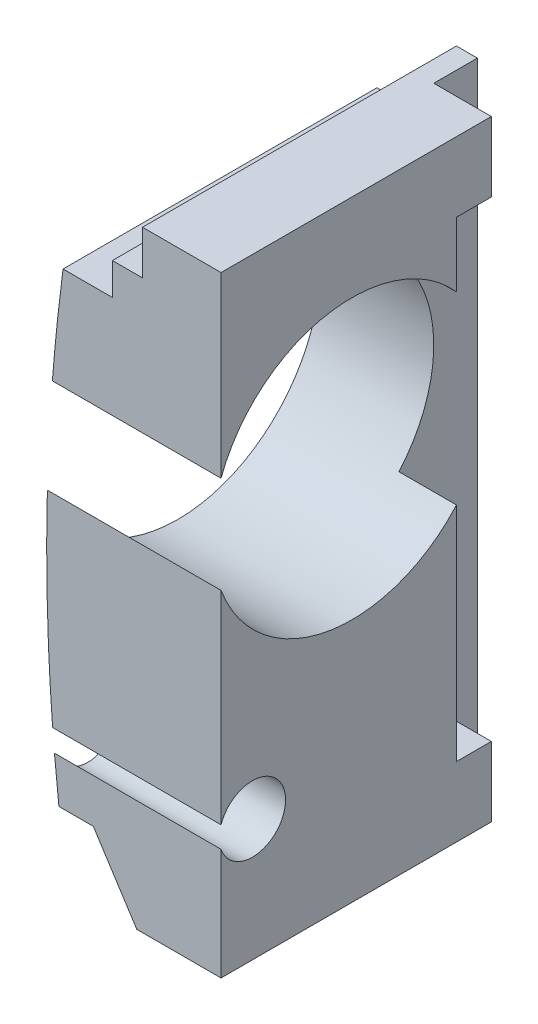
ISO-10303-21;
HEADER;
FILE_DESCRIPTION(('STEP AP214'),'2;1');
FILE_NAME('part.step','',(''),(''),'','','');
FILE_SCHEMA(('AUTOMOTIVE_DESIGN { 1 0 10303 214 1 1 1 1 }'));
ENDSEC;
DATA;
#1=APPLICATION_CONTEXT('core data for automotive mechanical design processes');
#2=APPLICATION_PROTOCOL_DEFINITION('international standard','automotive_design',2000,#1);
#3=PRODUCT_CONTEXT('',#1,'mechanical');
#4=PRODUCT('Part','Part','',(#3));
#5=PRODUCT_RELATED_PRODUCT_CATEGORY('part','',(#4));
#6=PRODUCT_DEFINITION_FORMATION('','',#4);
#7=PRODUCT_DEFINITION_CONTEXT('part definition',#1,'design');
#8=PRODUCT_DEFINITION('design','',#6,#7);
#9=PRODUCT_DEFINITION_SHAPE('','',#8);
#10=(LENGTH_UNIT() NAMED_UNIT(*) SI_UNIT(.MILLI.,.METRE.));
#11=(NAMED_UNIT(*) PLANE_ANGLE_UNIT() SI_UNIT($,.RADIAN.));
#12=(NAMED_UNIT(*) SI_UNIT($,.STERADIAN.) SOLID_ANGLE_UNIT());
#13=UNCERTAINTY_MEASURE_WITH_UNIT(LENGTH_MEASURE(1.E-05),#10,'distance_accuracy_value','');
#14=(GEOMETRIC_REPRESENTATION_CONTEXT(3) GLOBAL_UNCERTAINTY_ASSIGNED_CONTEXT((#13)) GLOBAL_UNIT_ASSIGNED_CONTEXT((#10,
#11,#12)) REPRESENTATION_CONTEXT('',''));
#15=CARTESIAN_POINT('',(0.,0.,0.));
#16=DIRECTION('',(0.,0.,1.));
#17=DIRECTION('',(1.,0.,0.));
#18=AXIS2_PLACEMENT_3D('',#15,#16,#17);
#19=CARTESIAN_POINT('',(-22.842394813776,32.9159687233325,18.));
#20=DIRECTION('',(-1.,0.,0.));
#21=DIRECTION('',(0.,-1.,0.));
#22=AXIS2_PLACEMENT_3D('',#19,#20,#21);
#23=PLANE('',#22);
#24=DIRECTION('',(0.,1.,0.));
#25=VECTOR('',#24,1.);
#26=CARTESIAN_POINT('',(-22.842394813776,32.9159687233325,18.));
#27=LINE('',#26,#25);
#28=CARTESIAN_POINT('',(-22.842394813776,22.6998509047475,18.));
#29=VERTEX_POINT('',#28);
#30=CARTESIAN_POINT('',(-22.842394813776,32.9159687233325,18.));
#31=VERTEX_POINT('',#30);
#32=EDGE_CURVE('E195',#29,#31,#27,.T.);
#33=ORIENTED_EDGE('',*,*,#32,.F.);
#34=CARTESIAN_POINT('',(-22.842394813776,19.9159687233325,10.5));
#35=DIRECTION('',(1.,0.,0.));
#36=DIRECTION('',(0.,1.,0.));
#37=AXIS2_PLACEMENT_3D('',#34,#35,#36);
#38=CIRCLE('',#37,8.);
#39=CARTESIAN_POINT('',(-22.842394813776,25.2074713454617,4.5));
#40=VERTEX_POINT('',#39);
#41=EDGE_CURVE('E181',#40,#29,#38,.T.);
#42=ORIENTED_EDGE('',*,*,#41,.F.);
#43=DIRECTION('',(0.,-1.,0.));
#44=VECTOR('',#43,1.);
#45=CARTESIAN_POINT('',(-22.842394813776,1.88120356476845,4.5));
#46=LINE('',#45,#44);
#47=CARTESIAN_POINT('',(-22.842394813776,28.9159687233325,4.5));
#48=VERTEX_POINT('',#47);
#49=EDGE_CURVE('E293',#48,#40,#46,.T.);
#50=ORIENTED_EDGE('',*,*,#49,.F.);
#51=DIRECTION('',(0.,0.,1.));
#52=VECTOR('',#51,1.);
#53=CARTESIAN_POINT('',(-22.842394813776,28.9159687233325,2.5));
#54=LINE('',#53,#52);
#55=CARTESIAN_POINT('',(-22.842394813776,28.9159687233325,2.5));
#56=VERTEX_POINT('',#55);
#57=EDGE_CURVE('E434',#56,#48,#54,.T.);
#58=ORIENTED_EDGE('',*,*,#57,.F.);
#59=DIRECTION('',(0.,1.,0.));
#60=VECTOR('',#59,1.);
#61=CARTESIAN_POINT('',(-22.842394813776,32.9159687233325,2.5));
#62=LINE('',#61,#60);
#63=CARTESIAN_POINT('',(-22.842394813776,32.9159687233325,2.5));
#64=VERTEX_POINT('',#63);
#65=EDGE_CURVE('E460',#56,#64,#62,.T.);
#66=ORIENTED_EDGE('',*,*,#65,.T.);
#67=DIRECTION('',(0.,0.,-1.));
#68=VECTOR('',#67,1.);
#69=CARTESIAN_POINT('',(-22.842394813776,32.9159687233325,18.));
#70=LINE('',#69,#68);
#71=EDGE_CURVE('E202',#31,#64,#70,.T.);
#72=ORIENTED_EDGE('',*,*,#71,.F.);
#73=EDGE_LOOP('',(#33,#42,#50,#58,#66,#72));
#74=FACE_BOUND('',#73,.T.);
#75=ADVANCED_FACE('F34',(#74),#23,.F.);
#76=CARTESIAN_POINT('',(-32.8382405200715,15.1637704583129,18.));
#77=DIRECTION('',(0.,0.,1.));
#78=DIRECTION('',(1.,0.,0.));
#79=AXIS2_PLACEMENT_3D('',#76,#77,#78);
#80=PLANE('',#79);
#81=DIRECTION('',(1.,0.,0.));
#82=VECTOR('',#81,1.);
#83=CARTESIAN_POINT('',(-72.842394813776,17.1320865419175,18.));
#84=LINE('',#83,#82);
#85=CARTESIAN_POINT('',(-32.8032889854127,17.1320865419175,18.));
#86=VERTEX_POINT('',#85);
#87=CARTESIAN_POINT('',(-22.842394813776,17.1320865419175,18.));
#88=VERTEX_POINT('',#87);
#89=EDGE_CURVE('E432',#86,#88,#84,.T.);
#90=ORIENTED_EDGE('',*,*,#89,.F.);
#91=CARTESIAN_POINT('',(-31.903618641324,28.5626366842533,18.));
#92=CARTESIAN_POINT('',(-32.3823408501101,24.9148379423341,18.));
#93=CARTESIAN_POINT('',(-32.8494402613355,19.124114905806,18.));
#94=CARTESIAN_POINT('',(-32.8647188936039,10.1521653361712,18.));
#95=CARTESIAN_POINT('',(-32.495187753187,4.88590614139292,18.));
#96=CARTESIAN_POINT('',(-32.1398179720088,1.75086777241078,18.));
#97=B_SPLINE_CURVE_WITH_KNOTS('',3,(#91,#92,#93,#94,#95,#96),.UNSPECIFIED.,.F.,.F.,(4,1,1,4),
(0.0157166231815551,0.414302548071928,0.642182974395133,0.984003613879941),.UNSPECIFIED.);
#98=CARTESIAN_POINT('',(-32.4992603551198,5.48947981779828,18.));
#99=VERTEX_POINT('',#98);
#100=EDGE_CURVE('E408',#86,#99,#97,.T.);
#101=ORIENTED_EDGE('',*,*,#100,.T.);
#102=DIRECTION('',(1.,0.,0.));
#103=VECTOR('',#102,1.);
#104=CARTESIAN_POINT('',(-72.842394813776,5.48947981779827,18.));
#105=LINE('',#104,#103);
#106=CARTESIAN_POINT('',(-22.842394813776,5.48947981779828,18.));
#107=VERTEX_POINT('',#106);
#108=EDGE_CURVE('E284',#107,#99,#105,.F.);
#109=ORIENTED_EDGE('',*,*,#108,.F.);
#110=EDGE_CURVE('E204',#107,#88,#27,.T.);
#111=ORIENTED_EDGE('',*,*,#110,.T.);
#112=EDGE_LOOP('',(#90,#101,#109,#111));
#113=FACE_BOUND('',#112,.T.);
#114=ADVANCED_FACE('F349',(#113),#80,.T.);
#115=CARTESIAN_POINT('',(-53.2527129269724,1.88120356476845,4.5));
#116=DIRECTION('',(0.,0.,1.));
#117=DIRECTION('',(1.,0.,0.));
#118=AXIS2_PLACEMENT_3D('',#115,#116,#117);
#119=PLANE('',#118);
#120=DIRECTION('',(0.,-1.,0.));
#121=VECTOR('',#120,1.);
#122=CARTESIAN_POINT('',(-26.1440698923477,1.88120356476849,4.5));
#123=LINE('',#122,#121);
#124=CARTESIAN_POINT('',(-26.1440698923477,14.6244661012033,4.5));
#125=VERTEX_POINT('',#124);
#126=CARTESIAN_POINT('',(-26.1440698923477,1.88120356476845,4.5));
#127=VERTEX_POINT('',#126);
#128=EDGE_CURVE('E300',#125,#127,#123,.T.);
#129=ORIENTED_EDGE('',*,*,#128,.F.);
#130=DIRECTION('',(1.,0.,0.));
#131=VECTOR('',#130,1.);
#132=CARTESIAN_POINT('',(-72.842394813776,14.6244661012033,4.5));
#133=LINE('',#132,#131);
#134=CARTESIAN_POINT('',(-22.842394813776,14.6244661012033,4.5));
#135=VERTEX_POINT('',#134);
#136=EDGE_CURVE('E12',#125,#135,#133,.T.);
#137=ORIENTED_EDGE('',*,*,#136,.T.);
#138=CARTESIAN_POINT('',(-22.842394813776,1.88120356476845,4.5));
#139=VERTEX_POINT('',#138);
#140=EDGE_CURVE('E462',#135,#139,#46,.T.);
#141=ORIENTED_EDGE('',*,*,#140,.T.);
#142=DIRECTION('',(1.,0.,0.));
#143=VECTOR('',#142,1.);
#144=CARTESIAN_POINT('',(-53.2527129269724,1.88120356476845,4.5));
#145=LINE('',#144,#143);
#146=EDGE_CURVE('E299',#127,#139,#145,.T.);
#147=ORIENTED_EDGE('',*,*,#146,.F.);
#148=EDGE_LOOP('',(#129,#137,#141,#147));
#149=FACE_BOUND('',#148,.T.);
#150=ADVANCED_FACE('F388',(#149),#119,.F.);
#151=CARTESIAN_POINT('',(-21.2112799765989,47.8812035647685,2.5));
#152=DIRECTION('',(0.,0.,1.));
#153=DIRECTION('',(1.,0.,0.));
#154=AXIS2_PLACEMENT_3D('',#151,#152,#153);
#155=PLANE('',#154);
#156=ORIENTED_EDGE('',*,*,#65,.F.);
#157=DIRECTION('',(1.,0.,0.));
#158=VECTOR('',#157,1.);
#159=CARTESIAN_POINT('',(-53.2527129269724,28.9159687233325,2.5));
#160=LINE('',#159,#158);
#161=CARTESIAN_POINT('',(-26.1440698923477,28.9159687233325,2.5));
#162=VERTEX_POINT('',#161);
#163=EDGE_CURVE('E310',#162,#56,#160,.T.);
#164=ORIENTED_EDGE('',*,*,#163,.F.);
#165=DIRECTION('',(0.,-1.,0.));
#166=VECTOR('',#165,1.);
#167=CARTESIAN_POINT('',(-26.1440698923478,47.8812035647684,2.5));
#168=LINE('',#167,#166);
#169=CARTESIAN_POINT('',(-26.1440698923477,32.9159687233325,2.5));
#170=VERTEX_POINT('',#169);
#171=EDGE_CURVE('E467',#170,#162,#168,.T.);
#172=ORIENTED_EDGE('',*,*,#171,.F.);
#173=DIRECTION('',(-1.,0.,0.));
#174=VECTOR('',#173,1.);
#175=CARTESIAN_POINT('',(-22.842394813776,32.9159687233325,2.5));
#176=LINE('',#175,#174);
#177=EDGE_CURVE('E281',#64,#170,#176,.T.);
#178=ORIENTED_EDGE('',*,*,#177,.F.);
#179=EDGE_LOOP('',(#156,#164,#172,#178));
#180=FACE_BOUND('',#179,.T.);
#181=ADVANCED_FACE('F345',(#180),#155,.F.);
#182=DIRECTION('',(1.,0.,0.));
#183=VECTOR('',#182,1.);
#184=CARTESIAN_POINT('',(-72.842394813776,4.27292731173862,18.));
#185=LINE('',#184,#183);
#186=CARTESIAN_POINT('',(-32.3963761262005,4.27292731173862,18.));
#187=VERTEX_POINT('',#186);
#188=CARTESIAN_POINT('',(-22.842394813776,4.27292731173863,18.));
#189=VERTEX_POINT('',#188);
#190=EDGE_CURVE('E287',#187,#189,#185,.T.);
#191=ORIENTED_EDGE('',*,*,#190,.F.);
#192=CARTESIAN_POINT('',(-32.1398179720088,1.75086777241078,18.));
#193=VERTEX_POINT('',#192);
#194=EDGE_CURVE('E403',#187,#193,#97,.T.);
#195=ORIENTED_EDGE('',*,*,#194,.T.);
#196=DIRECTION('',(1.,0.,0.));
#197=VECTOR('',#196,1.);
#198=CARTESIAN_POINT('',(-32.1398179720088,1.75086777241078,18.));
#199=LINE('',#198,#197);
#200=CARTESIAN_POINT('',(-30.1674269405555,1.75086777241077,18.));
#201=VERTEX_POINT('',#200);
#202=EDGE_CURVE('E415',#193,#201,#199,.T.);
#203=ORIENTED_EDGE('',*,*,#202,.T.);
#204=DIRECTION('',(0.541530480863366,-0.84068111570077,0.));
#205=VECTOR('',#204,1.);
#206=CARTESIAN_POINT('',(-30.1674269405555,1.75086777241077,18.));
#207=LINE('',#206,#205);
#208=CARTESIAN_POINT('',(-27.6747563190708,-2.11879643523155,18.));
#209=VERTEX_POINT('',#208);
#210=EDGE_CURVE('E209',#201,#209,#207,.T.);
#211=ORIENTED_EDGE('',*,*,#210,.T.);
#212=DIRECTION('',(1.,0.,0.));
#213=VECTOR('',#212,1.);
#214=CARTESIAN_POINT('',(-27.6747563190708,-2.11879643523155,18.));
#215=LINE('',#214,#213);
#216=CARTESIAN_POINT('',(-22.842394813776,-2.11879643523155,18.));
#217=VERTEX_POINT('',#216);
#218=EDGE_CURVE('E205',#209,#217,#215,.T.);
#219=ORIENTED_EDGE('',*,*,#218,.T.);
#220=EDGE_CURVE('E207',#217,#189,#27,.T.);
#221=ORIENTED_EDGE('',*,*,#220,.T.);
#222=EDGE_LOOP('',(#191,#195,#203,#211,#219,#221));
#223=FACE_BOUND('',#222,.T.);
#224=ADVANCED_FACE('F350',(#223),#80,.T.);
#225=CARTESIAN_POINT('',(-29.072656292173,30.3982312354477,18.));
#226=DIRECTION('',(1.,0.,0.));
#227=DIRECTION('',(0.,0.,-1.));
#228=AXIS2_PLACEMENT_3D('',#225,#226,#227);
#229=PLANE('',#228);
#230=DIRECTION('',(0.,-1.,0.));
#231=VECTOR('',#230,1.);
#232=CARTESIAN_POINT('',(-29.072656292173,30.3982312354477,0.));
#233=LINE('',#232,#231);
#234=CARTESIAN_POINT('',(-29.072656292173,30.3982312354477,0.));
#235=VERTEX_POINT('',#234);
#236=CARTESIAN_POINT('',(-29.072656292173,28.5626366842533,0.));
#237=VERTEX_POINT('',#236);
#238=EDGE_CURVE('E224',#235,#237,#233,.T.);
#239=ORIENTED_EDGE('',*,*,#238,.T.);
#240=DIRECTION('',(0.,0.,-1.));
#241=VECTOR('',#240,1.);
#242=CARTESIAN_POINT('',(-29.072656292173,28.5626366842533,18.));
#243=LINE('',#242,#241);
#244=CARTESIAN_POINT('',(-29.072656292173,28.5626366842533,18.));
#245=VERTEX_POINT('',#244);
#246=EDGE_CURVE('E275',#245,#237,#243,.T.);
#247=ORIENTED_EDGE('',*,*,#246,.F.);
#248=DIRECTION('',(0.,-1.,0.));
#249=VECTOR('',#248,1.);
#250=CARTESIAN_POINT('',(-29.072656292173,30.3982312354477,18.));
#251=LINE('',#250,#249);
#252=CARTESIAN_POINT('',(-29.072656292173,30.3982312354477,18.));
#253=VERTEX_POINT('',#252);
#254=EDGE_CURVE('E250',#253,#245,#251,.T.);
#255=ORIENTED_EDGE('',*,*,#254,.F.);
#256=DIRECTION('',(0.,0.,-1.));
#257=VECTOR('',#256,1.);
#258=CARTESIAN_POINT('',(-29.072656292173,30.3982312354477,18.));
#259=LINE('',#258,#257);
#260=EDGE_CURVE('E223',#253,#235,#259,.T.);
#261=ORIENTED_EDGE('',*,*,#260,.T.);
#262=EDGE_LOOP('',(#239,#247,#255,#261));
#263=FACE_BOUND('',#262,.T.);
#264=ADVANCED_FACE('F36',(#263),#229,.F.);
#265=CARTESIAN_POINT('',(-29.072656292173,28.5626366842533,18.));
#266=DIRECTION('',(0.,-1.,0.));
#267=DIRECTION('',(1.,0.,0.));
#268=AXIS2_PLACEMENT_3D('',#265,#266,#267);
#269=PLANE('',#268);
#270=DIRECTION('',(-1.,0.,0.));
#271=VECTOR('',#270,1.);
#272=CARTESIAN_POINT('',(-29.072656292173,28.5626366842533,0.));
#273=LINE('',#272,#271);
#274=CARTESIAN_POINT('',(-31.903618641324,28.5626366842533,0.));
#275=VERTEX_POINT('',#274);
#276=EDGE_CURVE('E227',#237,#275,#273,.T.);
#277=ORIENTED_EDGE('',*,*,#276,.T.);
#278=DIRECTION('',(0.,0.,-1.));
#279=VECTOR('',#278,1.);
#280=CARTESIAN_POINT('',(-31.903618641324,28.5626366842533,18.));
#281=LINE('',#280,#279);
#282=CARTESIAN_POINT('',(-31.903618641324,28.5626366842533,18.));
#283=VERTEX_POINT('',#282);
#284=EDGE_CURVE('E272',#283,#275,#281,.T.);
#285=ORIENTED_EDGE('',*,*,#284,.F.);
#286=DIRECTION('',(-1.,0.,0.));
#287=VECTOR('',#286,1.);
#288=CARTESIAN_POINT('',(-29.072656292173,28.5626366842533,18.));
#289=LINE('',#288,#287);
#290=EDGE_CURVE('E409',#245,#283,#289,.T.);
#291=ORIENTED_EDGE('',*,*,#290,.F.);
#292=ORIENTED_EDGE('',*,*,#246,.T.);
#293=EDGE_LOOP('',(#277,#285,#291,#292));
#294=FACE_BOUND('',#293,.T.);
#295=ADVANCED_FACE('F382',(#294),#269,.F.);
#296=DIRECTION('',(0.,0.,-1.));
#297=VECTOR('',#296,1.);
#298=SURFACE_OF_LINEAR_EXTRUSION('',#97,#297);
#299=ORIENTED_EDGE('',*,*,#100,.F.);
#300=CARTESIAN_POINT('',(-32.8032889854127,17.1320865419175,18.));
#301=CARTESIAN_POINT('',(-32.8089126020052,16.9214600813895,17.921845031579));
#302=CARTESIAN_POINT('',(-32.8138354732672,16.7141306814489,17.8347681022138));
#303=CARTESIAN_POINT('',(-32.8223902248455,16.3075139176539,17.64348839994));
#304=CARTESIAN_POINT('',(-32.8260221756164,16.1082261154386,17.5392865621133));
#305=CARTESIAN_POINT('',(-32.832103854364,15.7192656165157,17.3145522122593));
#306=CARTESIAN_POINT('',(-32.8345544823677,15.529585698668,17.1940322226758));
#307=CARTESIAN_POINT('',(-32.8384184840386,15.161028055253,16.9374643083615));
#308=CARTESIAN_POINT('',(-32.8398318688852,14.9821502132824,16.8014165510037));
#309=CARTESIAN_POINT('',(-32.8417782019137,14.6363925552622,16.5146935962891));
#310=CARTESIAN_POINT('',(-32.8423107665605,14.4695179960301,16.3640120571694));
#311=CARTESIAN_POINT('',(-32.8426630276085,14.1490360073593,16.0491396440074));
#312=CARTESIAN_POINT('',(-32.842482712056,13.995428800433,15.8849485434804));
#313=CARTESIAN_POINT('',(-32.8415834730333,13.7026021053062,15.5442562228344));
#314=CARTESIAN_POINT('',(-32.8408646487759,13.5633799722301,15.3677572756978));
#315=CARTESIAN_POINT('',(-32.8390621105723,13.3002785916481,15.0036749957464));
#316=CARTESIAN_POINT('',(-32.837978398032,13.176399285032,14.8160917056394));
#317=CARTESIAN_POINT('',(-32.8356122985452,12.9447789373648,14.4310339463182));
#318=CARTESIAN_POINT('',(-32.8343297720666,12.8370493357904,14.2335525968034));
#319=CARTESIAN_POINT('',(-32.8317213018723,12.638562880949,13.8301522313064));
#320=CARTESIAN_POINT('',(-32.8303953432733,12.5478119189963,13.6242303166863));
#321=CARTESIAN_POINT('',(-32.8278382654697,12.383975898061,13.2054815986105));
#322=CARTESIAN_POINT('',(-32.8266071433169,12.3108902897409,12.992655010102));
#323=CARTESIAN_POINT('',(-32.8243553084773,12.1828995543468,12.5615988389457));
#324=CARTESIAN_POINT('',(-32.8233345990714,12.1279947107541,12.3433691721081));
#325=CARTESIAN_POINT('',(-32.8215928939536,12.0367395703855,11.9029741519756));
#326=CARTESIAN_POINT('',(-32.8208720154227,12.0003965267273,11.680807295236));
#327=CARTESIAN_POINT('',(-32.8197912049345,11.9465554529277,11.2341957629615));
#328=CARTESIAN_POINT('',(-32.8194312810381,11.9290578436406,11.0097510366704));
#329=CARTESIAN_POINT('',(-32.8191020278202,11.9130356571871,10.5602407096189));
#330=CARTESIAN_POINT('',(-32.8191326020136,11.9145063932812,10.3351752759644));
#331=CARTESIAN_POINT('',(-32.8195816955308,11.9364028774843,9.88589055022647));
#332=CARTESIAN_POINT('',(-32.8200003491527,11.9568351874073,9.66167157804006));
#333=CARTESIAN_POINT('',(-32.8211910735615,12.0165077243638,9.21583475070931));
#334=CARTESIAN_POINT('',(-32.8219630155026,12.0557410948125,8.99421597745683));
#335=CARTESIAN_POINT('',(-32.8237950074469,12.1527345497964,8.55506796356223));
#336=CARTESIAN_POINT('',(-32.8248550619823,12.2104949257671,8.3375387873077));
#337=CARTESIAN_POINT('',(-32.8271693634164,12.3441318111187,7.90811820057501));
#338=CARTESIAN_POINT('',(-32.8284236112398,12.4200084067683,7.69622681694914));
#339=CARTESIAN_POINT('',(-32.8310069151095,12.5893402796623,7.27958340806862));
#340=CARTESIAN_POINT('',(-32.8323359728257,12.6827959494164,7.07483154234791));
#341=CARTESIAN_POINT('',(-32.8349279208851,12.8866178956187,6.67393266552692));
#342=CARTESIAN_POINT('',(-32.8361908132471,12.9969836557207,6.47778539192237));
#343=CARTESIAN_POINT('',(-32.8384932235211,13.233885226302,6.09541605192839));
#344=CARTESIAN_POINT('',(-32.8395326639198,13.3604266237627,5.90919744649128));
#345=CARTESIAN_POINT('',(-32.8412182147022,13.6287251732164,5.54811651875012));
#346=CARTESIAN_POINT('',(-32.8418643983304,13.770479485997,5.3732520871411));
#347=CARTESIAN_POINT('',(-32.842588954013,14.0682176825727,5.03608279531871));
#348=CARTESIAN_POINT('',(-32.8426673177043,14.2242017759155,4.87377812012539));
#349=CARTESIAN_POINT('',(-32.8420818869451,14.5492605059864,4.56291236089469));
#350=CARTESIAN_POINT('',(-32.8414182160588,14.7183329588669,4.41434899310319));
#351=CARTESIAN_POINT('',(-32.8391811926303,15.0683904337202,4.13198991435949));
#352=CARTESIAN_POINT('',(-32.8376078200366,15.2493757181964,3.99819452899899));
#353=CARTESIAN_POINT('',(-32.833396764857,15.6219280039682,3.74635213068816));
#354=CARTESIAN_POINT('',(-32.8307592867661,15.8134929660075,3.62830209766373));
#355=CARTESIAN_POINT('',(-32.8242824665052,16.2059356111055,3.40872167342684));
#356=CARTESIAN_POINT('',(-32.8204427091378,16.4068164908937,3.30719700755226));
#357=CARTESIAN_POINT('',(-32.8114552478534,16.8161075879997,3.1215661746285));
#358=CARTESIAN_POINT('',(-32.8063093604218,17.0245070064816,3.0374361087174));
#359=CARTESIAN_POINT('',(-32.7946232446765,17.447611395865,2.88700951301273));
#360=CARTESIAN_POINT('',(-32.7880829951931,17.6623164624584,2.82071325401249));
#361=CARTESIAN_POINT('',(-32.7735579314041,18.096489112226,2.70642027744047));
#362=CARTESIAN_POINT('',(-32.7655731555517,18.3159565684887,2.65842307285394));
#363=CARTESIAN_POINT('',(-32.7481445245425,18.7580980025666,2.5810540283192));
#364=CARTESIAN_POINT('',(-32.7387006370088,18.9807720514347,2.55168260174019));
#365=CARTESIAN_POINT('',(-32.7183830953817,19.4276046179223,2.51177214120087));
#366=CARTESIAN_POINT('',(-32.7075102808875,19.6517621909789,2.50122210094588));
#367=CARTESIAN_POINT('',(-32.6843882148956,20.100177750355,2.4989778876422));
#368=CARTESIAN_POINT('',(-32.6721384906883,20.324435744671,2.50729020917635));
#369=CARTESIAN_POINT('',(-32.64636769082,20.7713500729385,2.54270391945519));
#370=CARTESIAN_POINT('',(-32.632846834671,20.9940066763114,2.56980206920568));
#371=CARTESIAN_POINT('',(-32.6046683191728,21.4361951305758,2.64257549058981));
#372=CARTESIAN_POINT('',(-32.5900106309985,21.6557269020678,2.68825123339604));
#373=CARTESIAN_POINT('',(-32.5596892591988,22.0907062639336,2.79798959526108));
#374=CARTESIAN_POINT('',(-32.5440229741531,22.3061412715988,2.86210137105709));
#375=CARTESIAN_POINT('',(-32.5119244670109,22.7308044615019,3.00819642638337));
#376=CARTESIAN_POINT('',(-32.4954922447172,22.9400326421428,3.09017971051187));
#377=CARTESIAN_POINT('',(-32.4620934973072,23.3508261172599,3.2714346040401));
#378=CARTESIAN_POINT('',(-32.4451269527443,23.5523911322462,3.3707068432647));
#379=CARTESIAN_POINT('',(-32.4109158216864,23.9464388321316,3.58583350030297));
#380=CARTESIAN_POINT('',(-32.3936712403244,24.1389216844418,3.70168761230467));
#381=CARTESIAN_POINT('',(-32.359104562022,24.5142497005894,3.94968576611352));
#382=CARTESIAN_POINT('',(-32.3417824425283,24.6970511891847,4.08189591176728));
#383=CARTESIAN_POINT('',(-32.3074277638246,25.0507910536299,4.36124014533955));
#384=CARTESIAN_POINT('',(-32.2903951009065,25.2217337489871,4.5083687507013));
#385=CARTESIAN_POINT('',(-32.2569006955942,25.5506811574016,4.81661720391539));
#386=CARTESIAN_POINT('',(-32.2404391647468,25.7086811053568,4.97774216018877));
#387=CARTESIAN_POINT('',(-32.2083926788219,26.0104951150204,5.31275017871702));
#388=CARTESIAN_POINT('',(-32.1928074190089,26.154314121628,5.48662875663403));
#389=CARTESIAN_POINT('',(-32.1627884414583,26.4268358072144,5.84602511900994));
#390=CARTESIAN_POINT('',(-32.14835504697,26.555534247641,6.03154614479309));
#391=CARTESIAN_POINT('',(-32.1209158851089,26.7968333708435,6.4128727546043));
#392=CARTESIAN_POINT('',(-32.1079100869161,26.9094344011591,6.60867811647079));
#393=CARTESIAN_POINT('',(-32.0835751521614,27.1177178123852,7.00918955457634));
#394=CARTESIAN_POINT('',(-32.072246011284,27.2134002368445,7.21389560790315));
#395=CARTESIAN_POINT('',(-32.0514858120781,27.3871373629409,7.63074497795176));
#396=CARTESIAN_POINT('',(-32.0420547096306,27.4651924743224,7.84288812166697));
#397=CARTESIAN_POINT('',(-32.0253229840346,27.6027189775064,8.27192021119224));
#398=CARTESIAN_POINT('',(-32.0180110353873,27.6622892841704,8.48877701029394));
#399=CARTESIAN_POINT('',(-32.005596568718,27.762958447469,8.9267182312711));
#400=CARTESIAN_POINT('',(-32.0004932663282,27.8040638618311,9.14780112313992));
#401=CARTESIAN_POINT('',(-31.9925939307689,27.8675305798424,9.59271524523725));
#402=CARTESIAN_POINT('',(-31.9897982350692,27.8898891419154,9.81654687259149));
#403=CARTESIAN_POINT('',(-31.9865717283698,27.9156832232623,10.2653096254855));
#404=CARTESIAN_POINT('',(-31.9861408571178,27.9191192246557,10.4902407228662));
#405=CARTESIAN_POINT('',(-31.9876479717052,27.9070798598511,10.9382408500524));
#406=CARTESIAN_POINT('',(-31.9895718085282,27.891717450055,11.1613129718657));
#407=CARTESIAN_POINT('',(-31.9957261396622,27.8423860719759,11.6053545439666));
#408=CARTESIAN_POINT('',(-31.9999565973766,27.8084173988986,11.8263240275581));
#409=CARTESIAN_POINT('',(-32.0106411296761,27.7221186358642,12.2646309011405));
#410=CARTESIAN_POINT('',(-32.017095574704,27.6697854869663,12.4819676797157));
#411=CARTESIAN_POINT('',(-32.0320982773079,27.547166155821,12.9113611482599));
#412=CARTESIAN_POINT('',(-32.0406458202837,27.4768861004398,13.1234196131238));
#413=CARTESIAN_POINT('',(-32.0596737941848,27.3188429400291,13.5409374684433));
#414=CARTESIAN_POINT('',(-32.0701550943818,27.2310719709752,13.7463938421311));
#415=CARTESIAN_POINT('',(-32.0928464299646,27.0387060774869,14.1491669586383));
#416=CARTESIAN_POINT('',(-32.1050564242884,26.9341115526573,14.3464838946515));
#417=CARTESIAN_POINT('',(-32.1309770426968,26.708828292075,14.7316478672193));
#418=CARTESIAN_POINT('',(-32.144687929991,26.5881367325943,14.9194932342942));
#419=CARTESIAN_POINT('',(-32.1733544801309,26.3315332049348,15.2843786817838));
#420=CARTESIAN_POINT('',(-32.1883101328523,26.195621360549,15.4614188500637));
#421=CARTESIAN_POINT('',(-32.2193006353516,25.9085597244646,15.8046436067186));
#422=CARTESIAN_POINT('',(-32.2353421296211,25.7573126374945,15.9707462286566));
#423=CARTESIAN_POINT('',(-32.2681197192843,25.441487115864,16.2895575552547));
#424=CARTESIAN_POINT('',(-32.284855562931,25.276913492698,16.4422710528967));
#425=CARTESIAN_POINT('',(-32.3187291017118,24.935619934989,16.7332464758597));
#426=CARTESIAN_POINT('',(-32.3358666090886,24.7589056038371,16.8715149947857));
#427=CARTESIAN_POINT('',(-32.3702581068695,24.3945627660087,17.1326789919599));
#428=CARTESIAN_POINT('',(-32.3875120583997,24.2069377565149,17.2555793567807));
#429=CARTESIAN_POINT('',(-32.423346324635,23.8053941205738,17.4951120336787));
#430=CARTESIAN_POINT('',(-32.4419126092983,23.5906037024542,17.6102882037687));
#431=CARTESIAN_POINT('',(-32.4784972903573,23.1517822122617,17.8204325557992));
#432=CARTESIAN_POINT('',(-32.4965165987705,22.9277681778081,17.9154361623562));
#433=CARTESIAN_POINT('',(-32.51411419022,22.6998509047419,18.0000000000021));
#434=B_SPLINE_CURVE_WITH_KNOTS('',3,(#300,#301,#302,#303,#304,#305,#306,#307,#308,#309,#310,
#311,#312,#313,#314,#315,#316,#317,#318,#319,#320,#321,#322,#323,#324,#325,#326,#327,#328,#329,
#330,#331,#332,#333,#334,#335,#336,#337,#338,#339,#340,#341,#342,#343,#344,#345,#346,#347,#348,
#349,#350,#351,#352,#353,#354,#355,#356,#357,#358,#359,#360,#361,#362,#363,#364,#365,#366,#367,
#368,#369,#370,#371,#372,#373,#374,#375,#376,#377,#378,#379,#380,#381,#382,#383,#384,#385,#386,
#387,#388,#389,#390,#391,#392,#393,#394,#395,#396,#397,#398,#399,#400,#401,#402,#403,#404,#405,
#406,#407,#408,#409,#410,#411,#412,#413,#414,#415,#416,#417,#418,#419,#420,#421,#422,#423,#424,
#425,#426,#427,#428,#429,#430,#431,#432,#433),.UNSPECIFIED.,.F.,.F.,(4,2,2,2,2,2,2,2,2,2,2,2,2,
2,2,2,2,2,2,2,2,2,2,2,2,2,2,2,2,2,2,2,2,2,2,2,2,2,2,2,2,2,2,2,2,2,2,2,2,2,2,2,2,2,2,2,2,2,2,2,2,
2,2,2,2,2,4),(0.,0.673981702553465,1.34792661548333,2.02135724809854,2.69478062251858,
3.36849714821989,4.04222497092211,4.71582869908073,5.38942983201391,6.0635058714388,
6.73781537235216,7.41210390164476,8.08640294420687,8.76096527134833,9.4355426624365,
10.1099533806915,10.7845975715782,11.4589959125639,12.1334048625604,12.8078170241291,
13.4822442459245,14.1566508783286,14.8312910798948,15.5058055904537,16.1803300355176,
16.8547421749404,17.5291691802496,18.2034666389091,18.877997218029,19.5515947929218,
20.2252025953248,20.8987924689412,21.5723972912787,22.245608076416,22.9190506928925,
23.592377225352,24.2657208360628,24.9408767267055,25.6160327910619,26.2912134560405,
26.9663816705713,27.6443736830264,28.3221174292773,29.0001095878116,29.6778644879141,
30.3558089232402,31.0337387196735,31.7116667710784,32.3895790625174,33.0637985661048,
33.7377784338466,34.4118568485413,35.0859180886117,35.7559488248053,36.4259689306441,
37.0961006936549,37.7660039865652,38.4362091545125,39.1063984056341,39.7767053757873,
40.4470068944439,41.1218645508054,41.7964796296026,42.4707854132846,43.1448762415247,
43.877138292613,44.6081035995937),.UNSPECIFIED.);
#435=CARTESIAN_POINT('',(-32.5141141898731,22.6998509047475,18.));
#436=VERTEX_POINT('',#435);
#437=EDGE_CURVE('E199',#86,#436,#434,.T.);
#438=ORIENTED_EDGE('',*,*,#437,.T.);
#439=EDGE_CURVE('E198',#283,#436,#97,.T.);
#440=ORIENTED_EDGE('',*,*,#439,.F.);
#441=ORIENTED_EDGE('',*,*,#284,.T.);
#442=CARTESIAN_POINT('',(-31.903618641324,28.5626366842533,0.));
#443=CARTESIAN_POINT('',(-32.3823408501101,24.9148379423341,0.));
#444=CARTESIAN_POINT('',(-32.8494402613355,19.124114905806,0.));
#445=CARTESIAN_POINT('',(-32.8647188936039,10.1521653361712,0.));
#446=CARTESIAN_POINT('',(-32.495187753187,4.88590614139292,0.));
#447=CARTESIAN_POINT('',(-32.1398179720088,1.75086777241078,0.));
#448=B_SPLINE_CURVE_WITH_KNOTS('',3,(#442,#443,#444,#445,#446,#447),.UNSPECIFIED.,.F.,.F.,(4,1,
1,4),(0.0157166231815551,0.414302548071928,0.642182974395133,0.984003613879941),.UNSPECIFIED.);
#449=CARTESIAN_POINT('',(-32.1398179720088,1.75086777241078,0.));
#450=VERTEX_POINT('',#449);
#451=EDGE_CURVE('E230',#275,#450,#448,.T.);
#452=ORIENTED_EDGE('',*,*,#451,.T.);
#453=DIRECTION('',(0.,0.,-1.));
#454=VECTOR('',#453,1.);
#455=CARTESIAN_POINT('',(-32.1398179720088,1.75086777241078,18.));
#456=LINE('',#455,#454);
#457=EDGE_CURVE('E269',#193,#450,#456,.T.);
#458=ORIENTED_EDGE('',*,*,#457,.F.);
#459=ORIENTED_EDGE('',*,*,#194,.F.);
#460=CARTESIAN_POINT('',(-32.3963761262005,4.27292731173862,18.));
#461=CARTESIAN_POINT('',(-32.3918054175923,4.22221659216657,17.9828627458739));
#462=CARTESIAN_POINT('',(-32.3872662376386,4.17225195718352,17.9635894418836));
#463=CARTESIAN_POINT('',(-32.3782862509035,4.07411995822601,17.9208957753791));
#464=CARTESIAN_POINT('',(-32.3738454409011,4.02595253536815,17.8974755488783));
#465=CARTESIAN_POINT('',(-32.3607355594646,3.8847331213112,17.8212526447916));
#466=CARTESIAN_POINT('',(-32.3522658049319,3.79481767990742,17.762438156331));
#467=CARTESIAN_POINT('',(-32.3361896584893,3.62611498329835,17.6304696844872));
#468=CARTESIAN_POINT('',(-32.3285837332032,3.54733373700783,17.557308008662));
#469=CARTESIAN_POINT('',(-32.3145349336508,3.40317605947183,17.3987110430471));
#470=CARTESIAN_POINT('',(-32.3080917691141,3.33779628214297,17.3132788260525));
#471=CARTESIAN_POINT('',(-32.2966485316093,3.22249642832892,17.1328060508079));
#472=CARTESIAN_POINT('',(-32.2916444680377,3.17253357230736,17.037793069011));
#473=CARTESIAN_POINT('',(-32.2832664288687,3.08926910299257,16.8406413917585));
#474=CARTESIAN_POINT('',(-32.279892671118,3.05596971630614,16.7385017461001));
#475=CARTESIAN_POINT('',(-32.2749348966185,3.00714114112165,16.5305249149007));
#476=CARTESIAN_POINT('',(-32.2733425592104,2.99152933308538,16.4247073200998));
#477=CARTESIAN_POINT('',(-32.2719889805429,2.97825414686398,16.2119482370851));
#478=CARTESIAN_POINT('',(-32.272227586666,2.98058927272178,16.1050068432871));
#479=CARTESIAN_POINT('',(-32.2745220104556,3.0031059502686,15.8933261257129));
#480=CARTESIAN_POINT('',(-32.2765730442368,3.02324052055402,15.7885817475194));
#481=CARTESIAN_POINT('',(-32.2823967150395,3.08070386133796,15.583969799221));
#482=CARTESIAN_POINT('',(-32.286169390679,3.11803301752605,15.4841023385653));
#483=CARTESIAN_POINT('',(-32.2952803762306,3.2088517890196,15.2919560425759));
#484=CARTESIAN_POINT('',(-32.3006203559715,3.26235864212209,15.1996854359968));
#485=CARTESIAN_POINT('',(-32.3126426860584,3.38397864614947,15.0254332466953));
#486=CARTESIAN_POINT('',(-32.3193250558087,3.45209200821388,14.9434518127319));
#487=CARTESIAN_POINT('',(-32.3337948046614,3.60129114338314,14.7917425146298));
#488=CARTESIAN_POINT('',(-32.3415865799135,3.68242869765986,14.7220659968229));
#489=CARTESIAN_POINT('',(-32.3579555018301,3.85517216034533,14.5973111677436));
#490=CARTESIAN_POINT('',(-32.3665326697432,3.94677835199594,14.5422332515882));
#491=CARTESIAN_POINT('',(-32.3842013541243,4.13830999079034,14.4479864163088));
#492=CARTESIAN_POINT('',(-32.3932950100167,4.23827099458877,14.4088901483482));
#493=CARTESIAN_POINT('',(-32.4116505292634,4.44332779211149,14.3480543585157));
#494=CARTESIAN_POINT('',(-32.4209123952906,4.54842366747562,14.3263151127004));
#495=CARTESIAN_POINT('',(-32.4393342518807,4.76104554026246,14.3007752269235));
#496=CARTESIAN_POINT('',(-32.4484939384058,4.86857684565801,14.2970185258749));
#497=CARTESIAN_POINT('',(-32.4664228011508,5.08276805199763,14.3076814175052));
#498=CARTESIAN_POINT('',(-32.4751919771507,5.1894279524503,14.3221010204334));
#499=CARTESIAN_POINT('',(-32.4921076792055,5.39879375084472,14.3687170897144));
#500=CARTESIAN_POINT('',(-32.5002544706881,5.50150132495024,14.4009059293197));
#501=CARTESIAN_POINT('',(-32.5157420778073,5.70007254920946,14.4821637214722));
#502=CARTESIAN_POINT('',(-32.5230829022178,5.79593627386359,14.5312324902348));
#503=CARTESIAN_POINT('',(-32.5367958093443,5.97784343956719,14.6447358109321));
#504=CARTESIAN_POINT('',(-32.5431701836167,6.06390998595354,14.7091330542698));
#505=CARTESIAN_POINT('',(-32.5548642377385,6.22401200325506,14.8515404950391));
#506=CARTESIAN_POINT('',(-32.5601839350838,6.29804767374499,14.9295504666109));
#507=CARTESIAN_POINT('',(-32.5696807876326,6.43175516794429,15.096726132944));
#508=CARTESIAN_POINT('',(-32.5738611975583,6.49146784979658,15.1858589652848));
#509=CARTESIAN_POINT('',(-32.5810524265331,6.59508310801182,15.3729273564663));
#510=CARTESIAN_POINT('',(-32.5840632551523,6.63898581374025,15.470862843271));
#511=CARTESIAN_POINT('',(-32.5888820082264,6.70963206663184,15.6725176806512));
#512=CARTESIAN_POINT('',(-32.5906926303996,6.73641409128917,15.7762234880995));
#513=CARTESIAN_POINT('',(-32.5931077846329,6.77220386932781,15.9866702341792));
#514=CARTESIAN_POINT('',(-32.5937123413801,6.78121198652532,16.09341111064));
#515=CARTESIAN_POINT('',(-32.5937112073251,6.78119514107334,16.3067634482539));
#516=CARTESIAN_POINT('',(-32.5931069597839,6.77219168348044,16.4133749118499));
#517=CARTESIAN_POINT('',(-32.5906952893557,6.73645345671419,16.6235715282062));
#518=CARTESIAN_POINT('',(-32.5888878414676,6.70971831909866,16.7271566180355));
#519=CARTESIAN_POINT('',(-32.5840839204741,6.6392880566809,16.9283535758016));
#520=CARTESIAN_POINT('',(-32.5810875180859,6.59559394057787,17.0259657985974));
#521=CARTESIAN_POINT('',(-32.5739329871358,6.49249712195978,17.2124646128542));
#522=CARTESIAN_POINT('',(-32.5697748443411,6.43309422699196,17.3013510973954));
#523=CARTESIAN_POINT('',(-32.5603381927255,6.30020506083477,17.4679947643919));
#524=CARTESIAN_POINT('',(-32.555058245176,6.22670071622077,17.5457374382815));
#525=CARTESIAN_POINT('',(-32.5434533198349,6.06775519317851,17.6877637501209));
#526=CARTESIAN_POINT('',(-32.5371287399157,5.98231856134377,17.7520524912588));
#527=CARTESIAN_POINT('',(-32.5255816667061,5.82904512379671,17.8483828554303));
#528=CARTESIAN_POINT('',(-32.52059624665,5.76359875482366,17.88431616611));
#529=CARTESIAN_POINT('',(-32.5102211153707,5.62906643147198,17.9482133164978));
#530=CARTESIAN_POINT('',(-32.5048319701549,5.55998561148422,17.9761880591216));
#531=CARTESIAN_POINT('',(-32.4992603551578,5.48947981779828,18.));
#532=B_SPLINE_CURVE_WITH_KNOTS('',3,(#460,#461,#462,#463,#464,#465,#466,#467,#468,#469,#470,
#471,#472,#473,#474,#475,#476,#477,#478,#479,#480,#481,#482,#483,#484,#485,#486,#487,#488,#489,
#490,#491,#492,#493,#494,#495,#496,#497,#498,#499,#500,#501,#502,#503,#504,#505,#506,#507,#508,
#509,#510,#511,#512,#513,#514,#515,#516,#517,#518,#519,#520,#521,#522,#523,#524,#525,#526,#527,
#528,#529,#530,#531),.UNSPECIFIED.,.F.,.F.,(4,2,2,2,2,2,2,2,2,2,2,2,2,2,2,2,2,2,2,2,2,2,2,2,2,2,
2,2,2,2,2,2,2,2,2,4),(0.,0.161070262702278,0.322135243497117,0.643805972648195,0.96564964387809,
1.28741285892351,1.60827503141222,1.92918006671894,2.24857987790617,2.56795306598185,
2.8864857812412,3.20502564181522,3.52390611905004,3.84279120606579,4.16297702519132,
4.4831715093896,4.80480580204907,5.12644521006987,5.44887011853474,5.77129520881158,
6.09358201825239,6.41586531882427,6.73737208058516,7.05887350847125,7.37944660515275,
7.70001707867827,8.0198645365464,8.33970544735126,8.65916470958319,8.97863060998774,
9.29807751186433,9.6175283275581,9.93739134308339,10.2571328111262,10.4811317348715,
10.7048222949598),.UNSPECIFIED.);
#533=EDGE_CURVE('E316',#187,#99,#532,.T.);
#534=ORIENTED_EDGE('',*,*,#533,.T.);
#535=EDGE_LOOP('',(#299,#438,#440,#441,#452,#458,#459,#534));
#536=FACE_BOUND('',#535,.T.);
#537=ADVANCED_FACE('F326',(#536),#298,.F.);
#538=CARTESIAN_POINT('',(-32.1398179720088,1.75086777241078,18.));
#539=DIRECTION('',(0.,1.,0.));
#540=DIRECTION('',(-1.,0.,0.));
#541=AXIS2_PLACEMENT_3D('',#538,#539,#540);
#542=PLANE('',#541);
#543=DIRECTION('',(1.,0.,0.));
#544=VECTOR('',#543,1.);
#545=CARTESIAN_POINT('',(-32.1398179720088,1.75086777241078,0.));
#546=LINE('',#545,#544);
#547=CARTESIAN_POINT('',(-30.1674269405555,1.75086777241077,0.));
#548=VERTEX_POINT('',#547);
#549=EDGE_CURVE('E234',#450,#548,#546,.T.);
#550=ORIENTED_EDGE('',*,*,#549,.T.);
#551=DIRECTION('',(0.,0.,-1.));
#552=VECTOR('',#551,1.);
#553=CARTESIAN_POINT('',(-30.1674269405555,1.75086777241077,18.));
#554=LINE('',#553,#552);
#555=EDGE_CURVE('E266',#201,#548,#554,.T.);
#556=ORIENTED_EDGE('',*,*,#555,.F.);
#557=ORIENTED_EDGE('',*,*,#202,.F.);
#558=ORIENTED_EDGE('',*,*,#457,.T.);
#559=EDGE_LOOP('',(#550,#556,#557,#558));
#560=FACE_BOUND('',#559,.T.);
#561=ADVANCED_FACE('F375',(#560),#542,.F.);
#562=CARTESIAN_POINT('',(-30.1674269405555,1.75086777241077,18.));
#563=DIRECTION('',(0.84068111570077,0.541530480863366,0.));
#564=DIRECTION('',(-0.541530480863366,0.84068111570077,0.));
#565=AXIS2_PLACEMENT_3D('',#562,#563,#564);
#566=PLANE('',#565);
#567=DIRECTION('',(0.541530480863366,-0.84068111570077,0.));
#568=VECTOR('',#567,1.);
#569=CARTESIAN_POINT('',(-30.1674269405555,1.75086777241077,0.));
#570=LINE('',#569,#568);
#571=CARTESIAN_POINT('',(-27.6747563190708,-2.11879643523155,0.));
#572=VERTEX_POINT('',#571);
#573=EDGE_CURVE('E239',#548,#572,#570,.T.);
#574=ORIENTED_EDGE('',*,*,#573,.T.);
#575=DIRECTION('',(0.,0.,-1.));
#576=VECTOR('',#575,1.);
#577=CARTESIAN_POINT('',(-27.6747563190708,-2.11879643523155,18.));
#578=LINE('',#577,#576);
#579=EDGE_CURVE('E263',#209,#572,#578,.T.);
#580=ORIENTED_EDGE('',*,*,#579,.F.);
#581=ORIENTED_EDGE('',*,*,#210,.F.);
#582=ORIENTED_EDGE('',*,*,#555,.T.);
#583=EDGE_LOOP('',(#574,#580,#581,#582));
#584=FACE_BOUND('',#583,.T.);
#585=ADVANCED_FACE('F372',(#584),#566,.F.);
#586=CARTESIAN_POINT('',(-27.6747563190708,-2.11879643523155,18.));
#587=DIRECTION('',(0.,1.,0.));
#588=DIRECTION('',(-1.,0.,0.));
#589=AXIS2_PLACEMENT_3D('',#586,#587,#588);
#590=PLANE('',#589);
#591=DIRECTION('',(1.,0.,0.));
#592=VECTOR('',#591,1.);
#593=CARTESIAN_POINT('',(-27.6747563190708,-2.11879643523155,0.));
#594=LINE('',#593,#592);
#595=CARTESIAN_POINT('',(-26.1440698923477,-2.11879643523155,0.));
#596=VERTEX_POINT('',#595);
#597=EDGE_CURVE('E241',#572,#596,#594,.T.);
#598=ORIENTED_EDGE('',*,*,#597,.T.);
#599=DIRECTION('',(0.,0.,-1.));
#600=VECTOR('',#599,1.);
#601=CARTESIAN_POINT('',(-26.1440698923477,-2.11879643523155,0.));
#602=LINE('',#601,#600);
#603=CARTESIAN_POINT('',(-26.1440698923477,-2.11879643523155,2.5));
#604=VERTEX_POINT('',#603);
#605=EDGE_CURVE('E482',#604,#596,#602,.T.);
#606=ORIENTED_EDGE('',*,*,#605,.F.);
#607=DIRECTION('',(-1.,0.,0.));
#608=VECTOR('',#607,1.);
#609=CARTESIAN_POINT('',(-21.2112799765988,-2.11879643523154,2.5));
#610=LINE('',#609,#608);
#611=CARTESIAN_POINT('',(-22.842394813776,-2.11879643523155,2.5));
#612=VERTEX_POINT('',#611);
#613=EDGE_CURVE('E324',#612,#604,#610,.T.);
#614=ORIENTED_EDGE('',*,*,#613,.F.);
#615=DIRECTION('',(0.,0.,-1.));
#616=VECTOR('',#615,1.);
#617=CARTESIAN_POINT('',(-22.842394813776,-2.11879643523155,18.));
#618=LINE('',#617,#616);
#619=EDGE_CURVE('E260',#217,#612,#618,.T.);
#620=ORIENTED_EDGE('',*,*,#619,.F.);
#621=ORIENTED_EDGE('',*,*,#218,.F.);
#622=ORIENTED_EDGE('',*,*,#579,.T.);
#623=EDGE_LOOP('',(#598,#606,#614,#620,#621,#622));
#624=FACE_BOUND('',#623,.T.);
#625=ADVANCED_FACE('F368',(#624),#590,.F.);
#626=ORIENTED_EDGE('',*,*,#140,.F.);
#627=EDGE_CURVE('E190',#88,#135,#38,.T.);
#628=ORIENTED_EDGE('',*,*,#627,.F.);
#629=ORIENTED_EDGE('',*,*,#110,.F.);
#630=CARTESIAN_POINT('',(-22.842394813776,4.88120356476845,16.2));
#631=DIRECTION('',(1.,0.,0.));
#632=DIRECTION('',(0.,1.,0.));
#633=AXIS2_PLACEMENT_3D('',#630,#631,#632);
#634=CIRCLE('',#633,1.9);
#635=EDGE_CURVE('E314',#189,#107,#634,.T.);
#636=ORIENTED_EDGE('',*,*,#635,.F.);
#637=ORIENTED_EDGE('',*,*,#220,.F.);
#638=ORIENTED_EDGE('',*,*,#619,.T.);
#639=CARTESIAN_POINT('',(-22.842394813776,1.88120356476845,2.5));
#640=VERTEX_POINT('',#639);
#641=EDGE_CURVE('E228',#612,#640,#62,.T.);
#642=ORIENTED_EDGE('',*,*,#641,.T.);
#643=DIRECTION('',(0.,0.,-1.));
#644=VECTOR('',#643,1.);
#645=CARTESIAN_POINT('',(-22.842394813776,1.88120356476845,2.5));
#646=LINE('',#645,#644);
#647=EDGE_CURVE('E490',#139,#640,#646,.T.);
#648=ORIENTED_EDGE('',*,*,#647,.F.);
#649=EDGE_LOOP('',(#626,#628,#629,#636,#637,#638,#642,#648));
#650=FACE_BOUND('',#649,.T.);
#651=ADVANCED_FACE('F364',(#650),#23,.F.);
#652=CARTESIAN_POINT('',(-22.842394813776,32.9159687233325,18.));
#653=DIRECTION('',(0.,-1.,0.));
#654=DIRECTION('',(0.,0.,-1.));
#655=AXIS2_PLACEMENT_3D('',#652,#653,#654);
#656=PLANE('',#655);
#657=ORIENTED_EDGE('',*,*,#177,.T.);
#658=DIRECTION('',(0.,0.,-1.));
#659=VECTOR('',#658,1.);
#660=CARTESIAN_POINT('',(-26.1440698923477,32.9159687233325,18.));
#661=LINE('',#660,#659);
#662=CARTESIAN_POINT('',(-26.1440698923477,32.9159687233325,0.));
#663=VERTEX_POINT('',#662);
#664=EDGE_CURVE('E464',#170,#663,#661,.T.);
#665=ORIENTED_EDGE('',*,*,#664,.T.);
#666=DIRECTION('',(-1.,0.,0.));
#667=VECTOR('',#666,1.);
#668=CARTESIAN_POINT('',(-22.842394813776,32.9159687233325,0.));
#669=LINE('',#668,#667);
#670=CARTESIAN_POINT('',(-27.3454498937977,32.9159687233325,0.));
#671=VERTEX_POINT('',#670);
#672=EDGE_CURVE('E244',#663,#671,#669,.T.);
#673=ORIENTED_EDGE('',*,*,#672,.T.);
#674=DIRECTION('',(0.,0.,-1.));
#675=VECTOR('',#674,1.);
#676=CARTESIAN_POINT('',(-27.3454498937977,32.9159687233325,18.));
#677=LINE('',#676,#675);
#678=CARTESIAN_POINT('',(-27.3454498937977,32.9159687233325,18.));
#679=VERTEX_POINT('',#678);
#680=EDGE_CURVE('E256',#679,#671,#677,.T.);
#681=ORIENTED_EDGE('',*,*,#680,.F.);
#682=DIRECTION('',(-1.,0.,0.));
#683=VECTOR('',#682,1.);
#684=CARTESIAN_POINT('',(-22.842394813776,32.9159687233325,18.));
#685=LINE('',#684,#683);
#686=EDGE_CURVE('E213',#31,#679,#685,.T.);
#687=ORIENTED_EDGE('',*,*,#686,.F.);
#688=ORIENTED_EDGE('',*,*,#71,.T.);
#689=EDGE_LOOP('',(#657,#665,#673,#681,#687,#688));
#690=FACE_BOUND('',#689,.T.);
#691=ADVANCED_FACE('F360',(#690),#656,.F.);
#692=CARTESIAN_POINT('',(-27.3454498937977,30.3982312354477,18.));
#693=DIRECTION('',(1.,0.,0.));
#694=DIRECTION('',(0.,0.,-1.));
#695=AXIS2_PLACEMENT_3D('',#692,#693,#694);
#696=PLANE('',#695);
#697=DIRECTION('',(0.,-1.,0.));
#698=VECTOR('',#697,1.);
#699=CARTESIAN_POINT('',(-27.3454498937977,30.3982312354477,0.));
#700=LINE('',#699,#698);
#701=CARTESIAN_POINT('',(-27.3454498937977,30.3982312354477,0.));
#702=VERTEX_POINT('',#701);
#703=EDGE_CURVE('E246',#671,#702,#700,.T.);
#704=ORIENTED_EDGE('',*,*,#703,.T.);
#705=DIRECTION('',(0.,0.,-1.));
#706=VECTOR('',#705,1.);
#707=CARTESIAN_POINT('',(-27.3454498937977,30.3982312354477,18.));
#708=LINE('',#707,#706);
#709=CARTESIAN_POINT('',(-27.3454498937977,30.3982312354477,18.));
#710=VERTEX_POINT('',#709);
#711=EDGE_CURVE('E253',#710,#702,#708,.T.);
#712=ORIENTED_EDGE('',*,*,#711,.F.);
#713=DIRECTION('',(0.,-1.,0.));
#714=VECTOR('',#713,1.);
#715=CARTESIAN_POINT('',(-27.3454498937977,30.3982312354477,18.));
#716=LINE('',#715,#714);
#717=EDGE_CURVE('E217',#679,#710,#716,.T.);
#718=ORIENTED_EDGE('',*,*,#717,.F.);
#719=ORIENTED_EDGE('',*,*,#680,.T.);
#720=EDGE_LOOP('',(#704,#712,#718,#719));
#721=FACE_BOUND('',#720,.T.);
#722=ADVANCED_FACE('F356',(#721),#696,.F.);
#723=CARTESIAN_POINT('',(-29.072656292173,30.3982312354477,18.));
#724=DIRECTION('',(0.,-1.,0.));
#725=DIRECTION('',(0.,0.,-1.));
#726=AXIS2_PLACEMENT_3D('',#723,#724,#725);
#727=PLANE('',#726);
#728=DIRECTION('',(-1.,0.,0.));
#729=VECTOR('',#728,1.);
#730=CARTESIAN_POINT('',(-29.072656292173,30.3982312354477,0.));
#731=LINE('',#730,#729);
#732=EDGE_CURVE('E248',#702,#235,#731,.T.);
#733=ORIENTED_EDGE('',*,*,#732,.T.);
#734=ORIENTED_EDGE('',*,*,#260,.F.);
#735=DIRECTION('',(-1.,0.,0.));
#736=VECTOR('',#735,1.);
#737=CARTESIAN_POINT('',(-29.072656292173,30.3982312354477,18.));
#738=LINE('',#737,#736);
#739=EDGE_CURVE('E219',#710,#253,#738,.T.);
#740=ORIENTED_EDGE('',*,*,#739,.F.);
#741=ORIENTED_EDGE('',*,*,#711,.T.);
#742=EDGE_LOOP('',(#733,#734,#740,#741));
#743=FACE_BOUND('',#742,.T.);
#744=ADVANCED_FACE('F348',(#743),#727,.F.);
#745=DIRECTION('',(1.,0.,0.));
#746=VECTOR('',#745,1.);
#747=CARTESIAN_POINT('',(-72.842394813776,22.6998509047475,18.));
#748=LINE('',#747,#746);
#749=EDGE_CURVE('E184',#29,#436,#748,.F.);
#750=ORIENTED_EDGE('',*,*,#749,.F.);
#751=ORIENTED_EDGE('',*,*,#32,.T.);
#752=ORIENTED_EDGE('',*,*,#686,.T.);
#753=ORIENTED_EDGE('',*,*,#717,.T.);
#754=ORIENTED_EDGE('',*,*,#739,.T.);
#755=ORIENTED_EDGE('',*,*,#254,.T.);
#756=ORIENTED_EDGE('',*,*,#290,.T.);
#757=ORIENTED_EDGE('',*,*,#439,.T.);
#758=EDGE_LOOP('',(#750,#751,#752,#753,#754,#755,#756,#757));
#759=FACE_BOUND('',#758,.T.);
#760=ADVANCED_FACE('F194',(#759),#80,.T.);
#761=CARTESIAN_POINT('',(-32.8382405200715,15.1637704583129,0.));
#762=DIRECTION('',(0.,0.,1.));
#763=DIRECTION('',(1.,0.,0.));
#764=AXIS2_PLACEMENT_3D('',#761,#762,#763);
#765=PLANE('',#764);
#766=ORIENTED_EDGE('',*,*,#672,.F.);
#767=DIRECTION('',(0.,-1.,0.));
#768=VECTOR('',#767,1.);
#769=CARTESIAN_POINT('',(-26.1440698923477,15.1637704583129,0.));
#770=LINE('',#769,#768);
#771=EDGE_CURVE('E278',#663,#596,#770,.T.);
#772=ORIENTED_EDGE('',*,*,#771,.T.);
#773=ORIENTED_EDGE('',*,*,#597,.F.);
#774=ORIENTED_EDGE('',*,*,#573,.F.);
#775=ORIENTED_EDGE('',*,*,#549,.F.);
#776=ORIENTED_EDGE('',*,*,#451,.F.);
#777=ORIENTED_EDGE('',*,*,#276,.F.);
#778=ORIENTED_EDGE('',*,*,#238,.F.);
#779=ORIENTED_EDGE('',*,*,#732,.F.);
#780=ORIENTED_EDGE('',*,*,#703,.F.);
#781=EDGE_LOOP('',(#766,#772,#773,#774,#775,#776,#777,#778,#779,#780));
#782=FACE_BOUND('',#781,.T.);
#783=ADVANCED_FACE('F343',(#782),#765,.F.);
#784=CARTESIAN_POINT('',(-26.1440698923477,1.88120356476846,2.5));
#785=VERTEX_POINT('',#784);
#786=EDGE_CURVE('E483',#785,#604,#168,.T.);
#787=ORIENTED_EDGE('',*,*,#786,.F.);
#788=DIRECTION('',(1.,0.,0.));
#789=VECTOR('',#788,1.);
#790=CARTESIAN_POINT('',(-53.2527129269724,1.88120356476845,2.5));
#791=LINE('',#790,#789);
#792=EDGE_CURVE('E308',#785,#640,#791,.T.);
#793=ORIENTED_EDGE('',*,*,#792,.T.);
#794=ORIENTED_EDGE('',*,*,#641,.F.);
#795=ORIENTED_EDGE('',*,*,#613,.T.);
#796=EDGE_LOOP('',(#787,#793,#794,#795));
#797=FACE_BOUND('',#796,.T.);
#798=ADVANCED_FACE('F340',(#797),#155,.F.);
#799=CARTESIAN_POINT('',(-26.1440698923478,47.8812035647684,0.));
#800=DIRECTION('',(-1.,0.,0.));
#801=DIRECTION('',(0.,-1.,0.));
#802=AXIS2_PLACEMENT_3D('',#799,#800,#801);
#803=PLANE('',#802);
#804=CARTESIAN_POINT('',(-26.1440698923477,28.9159687233325,4.5));
#805=VERTEX_POINT('',#804);
#806=CARTESIAN_POINT('',(-26.1440698923477,25.2074713454617,4.5));
#807=VERTEX_POINT('',#806);
#808=EDGE_CURVE('E291',#805,#807,#123,.T.);
#809=ORIENTED_EDGE('',*,*,#808,.T.);
#810=CARTESIAN_POINT('',(-26.1440698923477,19.9159687233325,10.5));
#811=DIRECTION('',(-1.,0.,0.));
#812=DIRECTION('',(0.,-1.,0.));
#813=AXIS2_PLACEMENT_3D('',#810,#811,#812);
#814=CIRCLE('',#813,8.);
#815=EDGE_CURVE('E49',#807,#125,#814,.T.);
#816=ORIENTED_EDGE('',*,*,#815,.T.);
#817=ORIENTED_EDGE('',*,*,#128,.T.);
#818=DIRECTION('',(0.,0.,-1.));
#819=VECTOR('',#818,1.);
#820=CARTESIAN_POINT('',(-26.1440698923477,1.88120356476845,2.5));
#821=LINE('',#820,#819);
#822=EDGE_CURVE('E57',#127,#785,#821,.T.);
#823=ORIENTED_EDGE('',*,*,#822,.T.);
#824=ORIENTED_EDGE('',*,*,#786,.T.);
#825=ORIENTED_EDGE('',*,*,#605,.T.);
#826=ORIENTED_EDGE('',*,*,#771,.F.);
#827=ORIENTED_EDGE('',*,*,#664,.F.);
#828=ORIENTED_EDGE('',*,*,#171,.T.);
#829=DIRECTION('',(0.,0.,1.));
#830=VECTOR('',#829,1.);
#831=CARTESIAN_POINT('',(-26.1440698923477,28.9159687233325,2.5));
#832=LINE('',#831,#830);
#833=EDGE_CURVE('E298',#162,#805,#832,.T.);
#834=ORIENTED_EDGE('',*,*,#833,.T.);
#835=EDGE_LOOP('',(#809,#816,#817,#823,#824,#825,#826,#827,#828,#834));
#836=FACE_BOUND('',#835,.T.);
#837=ADVANCED_FACE('F295',(#836),#803,.F.);
#838=CARTESIAN_POINT('',(-72.842394813776,4.88120356476845,16.2));
#839=DIRECTION('',(1.,0.,0.));
#840=DIRECTION('',(0.,1.,0.));
#841=AXIS2_PLACEMENT_3D('',#838,#839,#840);
#842=CYLINDRICAL_SURFACE('',#841,1.9);
#843=ORIENTED_EDGE('',*,*,#190,.T.);
#844=ORIENTED_EDGE('',*,*,#635,.T.);
#845=ORIENTED_EDGE('',*,*,#108,.T.);
#846=ORIENTED_EDGE('',*,*,#533,.F.);
#847=EDGE_LOOP('',(#843,#844,#845,#846));
#848=FACE_BOUND('',#847,.T.);
#849=ADVANCED_FACE('F330',(#848),#842,.F.);
#850=CARTESIAN_POINT('',(-53.2527129269724,28.9159687233325,2.5));
#851=DIRECTION('',(0.,1.,0.));
#852=DIRECTION('',(0.,0.,1.));
#853=AXIS2_PLACEMENT_3D('',#850,#851,#852);
#854=PLANE('',#853);
#855=ORIENTED_EDGE('',*,*,#163,.T.);
#856=ORIENTED_EDGE('',*,*,#57,.T.);
#857=DIRECTION('',(1.,0.,0.));
#858=VECTOR('',#857,1.);
#859=CARTESIAN_POINT('',(-53.2527129269724,28.9159687233325,4.5));
#860=LINE('',#859,#858);
#861=EDGE_CURVE('E304',#805,#48,#860,.T.);
#862=ORIENTED_EDGE('',*,*,#861,.F.);
#863=ORIENTED_EDGE('',*,*,#833,.F.);
#864=EDGE_LOOP('',(#855,#856,#862,#863));
#865=FACE_BOUND('',#864,.T.);
#866=ADVANCED_FACE('F335',(#865),#854,.F.);
#867=ORIENTED_EDGE('',*,*,#49,.T.);
#868=DIRECTION('',(1.,0.,0.));
#869=VECTOR('',#868,1.);
#870=CARTESIAN_POINT('',(-72.842394813776,25.2074713454617,4.5));
#871=LINE('',#870,#869);
#872=EDGE_CURVE('E42',#40,#807,#871,.F.);
#873=ORIENTED_EDGE('',*,*,#872,.T.);
#874=ORIENTED_EDGE('',*,*,#808,.F.);
#875=ORIENTED_EDGE('',*,*,#861,.T.);
#876=EDGE_LOOP('',(#867,#873,#874,#875));
#877=FACE_BOUND('',#876,.T.);
#878=ADVANCED_FACE('F290',(#877),#119,.F.);
#879=CARTESIAN_POINT('',(-53.2527129269724,1.88120356476845,2.5));
#880=DIRECTION('',(0.,-1.,0.));
#881=DIRECTION('',(1.,0.,0.));
#882=AXIS2_PLACEMENT_3D('',#879,#880,#881);
#883=PLANE('',#882);
#884=ORIENTED_EDGE('',*,*,#146,.T.);
#885=ORIENTED_EDGE('',*,*,#647,.T.);
#886=ORIENTED_EDGE('',*,*,#792,.F.);
#887=ORIENTED_EDGE('',*,*,#822,.F.);
#888=EDGE_LOOP('',(#884,#885,#886,#887));
#889=FACE_BOUND('',#888,.T.);
#890=ADVANCED_FACE('F445',(#889),#883,.F.);
#891=CARTESIAN_POINT('',(-72.842394813776,19.9159687233325,10.5));
#892=DIRECTION('',(1.,0.,0.));
#893=DIRECTION('',(0.,1.,0.));
#894=AXIS2_PLACEMENT_3D('',#891,#892,#893);
#895=CYLINDRICAL_SURFACE('',#894,8.);
#896=ORIENTED_EDGE('',*,*,#89,.T.);
#897=ORIENTED_EDGE('',*,*,#627,.T.);
#898=ORIENTED_EDGE('',*,*,#136,.F.);
#899=ORIENTED_EDGE('',*,*,#815,.F.);
#900=ORIENTED_EDGE('',*,*,#872,.F.);
#901=ORIENTED_EDGE('',*,*,#41,.T.);
#902=ORIENTED_EDGE('',*,*,#749,.T.);
#903=ORIENTED_EDGE('',*,*,#437,.F.);
#904=EDGE_LOOP('',(#896,#897,#898,#899,#900,#901,#902,#903));
#905=FACE_BOUND('',#904,.T.);
#906=ADVANCED_FACE('F183',(#905),#895,.F.);
#907=CLOSED_SHELL('',(#75,#114,#150,#181,#224,#264,#295,#537,#561,#585,#625,#651,#691,#722,#744,
#760,#783,#798,#837,#849,#866,#878,#890,#906));
#908=MANIFOLD_SOLID_BREP('B2',#907);
#909=ADVANCED_BREP_SHAPE_REPRESENTATION('',(#18,#908),#14);
#910=SHAPE_DEFINITION_REPRESENTATION(#9,#909);
ENDSEC;
END-ISO-10303-21;
